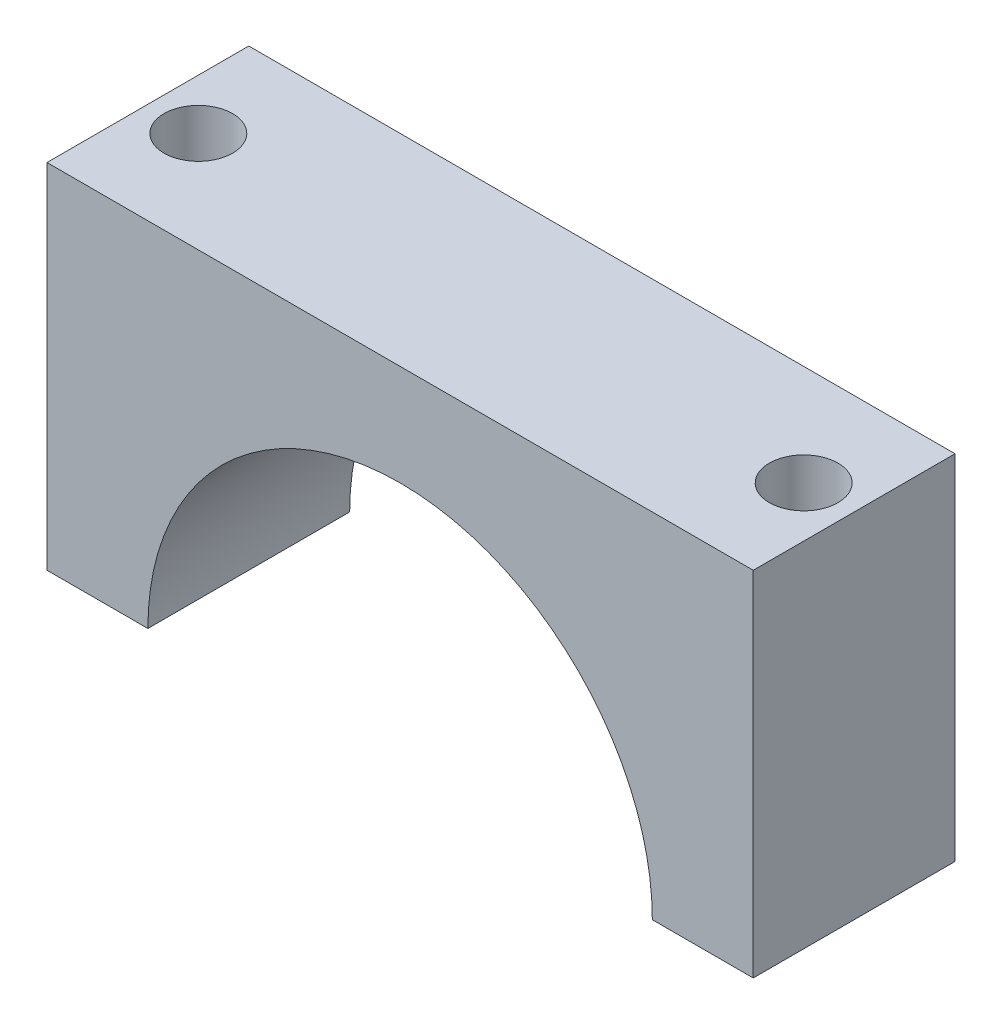
ISO-10303-21;
HEADER;
FILE_DESCRIPTION(('STEP AP214'),'2;1');
FILE_NAME('part.step','',(''),(''),'','','');
FILE_SCHEMA(('AUTOMOTIVE_DESIGN { 1 0 10303 214 1 1 1 1 }'));
ENDSEC;
DATA;
#1=APPLICATION_CONTEXT('core data for automotive mechanical design processes');
#2=APPLICATION_PROTOCOL_DEFINITION('international standard','automotive_design',2000,#1);
#3=PRODUCT_CONTEXT('',#1,'mechanical');
#4=PRODUCT('Part','Part','',(#3));
#5=PRODUCT_RELATED_PRODUCT_CATEGORY('part','',(#4));
#6=PRODUCT_DEFINITION_FORMATION('','',#4);
#7=PRODUCT_DEFINITION_CONTEXT('part definition',#1,'design');
#8=PRODUCT_DEFINITION('design','',#6,#7);
#9=PRODUCT_DEFINITION_SHAPE('','',#8);
#10=(LENGTH_UNIT() NAMED_UNIT(*) SI_UNIT(.MILLI.,.METRE.));
#11=(NAMED_UNIT(*) PLANE_ANGLE_UNIT() SI_UNIT($,.RADIAN.));
#12=(NAMED_UNIT(*) SI_UNIT($,.STERADIAN.) SOLID_ANGLE_UNIT());
#13=UNCERTAINTY_MEASURE_WITH_UNIT(LENGTH_MEASURE(1.E-05),#10,'distance_accuracy_value','');
#14=(GEOMETRIC_REPRESENTATION_CONTEXT(3) GLOBAL_UNCERTAINTY_ASSIGNED_CONTEXT((#13)) GLOBAL_UNIT_ASSIGNED_CONTEXT((#10,
#11,#12)) REPRESENTATION_CONTEXT('',''));
#15=CARTESIAN_POINT('',(0.,0.,0.));
#16=DIRECTION('',(0.,0.,1.));
#17=DIRECTION('',(1.,0.,0.));
#18=AXIS2_PLACEMENT_3D('',#15,#16,#17);
#19=CARTESIAN_POINT('',(17.5,0.,10.));
#20=DIRECTION('',(-1.,0.,0.));
#21=DIRECTION('',(0.,-1.,0.));
#22=AXIS2_PLACEMENT_3D('',#19,#20,#21);
#23=PLANE('',#22);
#24=DIRECTION('',(0.,1.,0.));
#25=VECTOR('',#24,1.);
#26=CARTESIAN_POINT('',(17.5,0.,0.));
#27=LINE('',#26,#25);
#28=CARTESIAN_POINT('',(17.5,0.,0.));
#29=VERTEX_POINT('',#28);
#30=CARTESIAN_POINT('',(17.5,17.5,0.));
#31=VERTEX_POINT('',#30);
#32=EDGE_CURVE('E116',#29,#31,#27,.T.);
#33=ORIENTED_EDGE('',*,*,#32,.T.);
#34=DIRECTION('',(0.,0.,-1.));
#35=VECTOR('',#34,1.);
#36=CARTESIAN_POINT('',(17.5,17.5,10.));
#37=LINE('',#36,#35);
#38=CARTESIAN_POINT('',(17.5,17.5,10.));
#39=VERTEX_POINT('',#38);
#40=EDGE_CURVE('E11',#39,#31,#37,.T.);
#41=ORIENTED_EDGE('',*,*,#40,.F.);
#42=DIRECTION('',(0.,1.,0.));
#43=VECTOR('',#42,1.);
#44=CARTESIAN_POINT('',(17.5,0.,10.));
#45=LINE('',#44,#43);
#46=CARTESIAN_POINT('',(17.5,0.,10.));
#47=VERTEX_POINT('',#46);
#48=EDGE_CURVE('E127',#47,#39,#45,.T.);
#49=ORIENTED_EDGE('',*,*,#48,.F.);
#50=DIRECTION('',(0.,0.,-1.));
#51=VECTOR('',#50,1.);
#52=CARTESIAN_POINT('',(17.5,0.,10.));
#53=LINE('',#52,#51);
#54=EDGE_CURVE('E112',#47,#29,#53,.T.);
#55=ORIENTED_EDGE('',*,*,#54,.T.);
#56=EDGE_LOOP('',(#33,#41,#49,#55));
#57=FACE_BOUND('',#56,.T.);
#58=ADVANCED_FACE('F32',(#57),#23,.F.);
#59=CARTESIAN_POINT('',(-17.5,17.5,10.));
#60=DIRECTION('',(0.,-1.,0.));
#61=DIRECTION('',(0.,0.,-1.));
#62=AXIS2_PLACEMENT_3D('',#59,#60,#61);
#63=PLANE('',#62);
#64=CARTESIAN_POINT('',(-15.,17.5,5.));
#65=DIRECTION('',(0.,1.,0.));
#66=DIRECTION('',(0.,0.,1.));
#67=AXIS2_PLACEMENT_3D('',#64,#65,#66);
#68=CIRCLE('',#67,1.7);
#69=CARTESIAN_POINT('',(-15.,17.5,6.7));
#70=VERTEX_POINT('',#69);
#71=EDGE_CURVE('E174',#70,#70,#68,.T.);
#72=ORIENTED_EDGE('',*,*,#71,.F.);
#73=EDGE_LOOP('',(#72));
#74=FACE_BOUND('',#73,.T.);
#75=CARTESIAN_POINT('',(15.,17.5,5.));
#76=DIRECTION('',(0.,1.,0.));
#77=DIRECTION('',(0.,0.,1.));
#78=AXIS2_PLACEMENT_3D('',#75,#76,#77);
#79=CIRCLE('',#78,1.7);
#80=CARTESIAN_POINT('',(15.,17.5,6.7));
#81=VERTEX_POINT('',#80);
#82=EDGE_CURVE('E173',#81,#81,#79,.T.);
#83=ORIENTED_EDGE('',*,*,#82,.F.);
#84=EDGE_LOOP('',(#83));
#85=FACE_BOUND('',#84,.T.);
#86=DIRECTION('',(-1.,0.,0.));
#87=VECTOR('',#86,1.);
#88=CARTESIAN_POINT('',(-17.5,17.5,0.));
#89=LINE('',#88,#87);
#90=CARTESIAN_POINT('',(-17.5,17.5,0.));
#91=VERTEX_POINT('',#90);
#92=EDGE_CURVE('E119',#31,#91,#89,.T.);
#93=ORIENTED_EDGE('',*,*,#92,.T.);
#94=DIRECTION('',(0.,0.,-1.));
#95=VECTOR('',#94,1.);
#96=CARTESIAN_POINT('',(-17.5,17.5,10.));
#97=LINE('',#96,#95);
#98=CARTESIAN_POINT('',(-17.5,17.5,10.));
#99=VERTEX_POINT('',#98);
#100=EDGE_CURVE('E40',#99,#91,#97,.T.);
#101=ORIENTED_EDGE('',*,*,#100,.F.);
#102=DIRECTION('',(-1.,0.,0.));
#103=VECTOR('',#102,1.);
#104=CARTESIAN_POINT('',(-17.5,17.5,10.));
#105=LINE('',#104,#103);
#106=EDGE_CURVE('E85',#39,#99,#105,.T.);
#107=ORIENTED_EDGE('',*,*,#106,.F.);
#108=ORIENTED_EDGE('',*,*,#40,.T.);
#109=EDGE_LOOP('',(#93,#101,#107,#108));
#110=FACE_BOUND('',#109,.T.);
#111=ADVANCED_FACE('F153',(#74,#85,#110),#63,.F.);
#112=CARTESIAN_POINT('',(-17.5,0.,10.));
#113=DIRECTION('',(1.,0.,0.));
#114=DIRECTION('',(0.,0.,-1.));
#115=AXIS2_PLACEMENT_3D('',#112,#113,#114);
#116=PLANE('',#115);
#117=DIRECTION('',(0.,-1.,0.));
#118=VECTOR('',#117,1.);
#119=CARTESIAN_POINT('',(-17.5,0.,0.));
#120=LINE('',#119,#118);
#121=CARTESIAN_POINT('',(-17.5,0.,0.));
#122=VERTEX_POINT('',#121);
#123=EDGE_CURVE('E122',#91,#122,#120,.T.);
#124=ORIENTED_EDGE('',*,*,#123,.T.);
#125=DIRECTION('',(0.,0.,-1.));
#126=VECTOR('',#125,1.);
#127=CARTESIAN_POINT('',(-17.5,0.,10.));
#128=LINE('',#127,#126);
#129=CARTESIAN_POINT('',(-17.5,0.,10.));
#130=VERTEX_POINT('',#129);
#131=EDGE_CURVE('E107',#130,#122,#128,.T.);
#132=ORIENTED_EDGE('',*,*,#131,.F.);
#133=DIRECTION('',(0.,-1.,0.));
#134=VECTOR('',#133,1.);
#135=CARTESIAN_POINT('',(-17.5,0.,10.));
#136=LINE('',#135,#134);
#137=EDGE_CURVE('E98',#99,#130,#136,.T.);
#138=ORIENTED_EDGE('',*,*,#137,.F.);
#139=ORIENTED_EDGE('',*,*,#100,.T.);
#140=EDGE_LOOP('',(#124,#132,#138,#139));
#141=FACE_BOUND('',#140,.T.);
#142=ADVANCED_FACE('F133',(#141),#116,.F.);
#143=CARTESIAN_POINT('',(-12.5,0.,10.));
#144=DIRECTION('',(0.,1.,0.));
#145=DIRECTION('',(0.,0.,1.));
#146=AXIS2_PLACEMENT_3D('',#143,#144,#145);
#147=PLANE('',#146);
#148=CARTESIAN_POINT('',(-15.,0.,5.));
#149=DIRECTION('',(0.,1.,0.));
#150=DIRECTION('',(0.,0.,1.));
#151=AXIS2_PLACEMENT_3D('',#148,#149,#150);
#152=CIRCLE('',#151,1.7);
#153=CARTESIAN_POINT('',(-15.,0.,6.7));
#154=VERTEX_POINT('',#153);
#155=EDGE_CURVE('E171',#154,#154,#152,.T.);
#156=ORIENTED_EDGE('',*,*,#155,.T.);
#157=EDGE_LOOP('',(#156));
#158=FACE_BOUND('',#157,.T.);
#159=DIRECTION('',(1.,0.,0.));
#160=VECTOR('',#159,1.);
#161=CARTESIAN_POINT('',(-12.5,0.,0.));
#162=LINE('',#161,#160);
#163=CARTESIAN_POINT('',(-12.5,0.,0.));
#164=VERTEX_POINT('',#163);
#165=EDGE_CURVE('E106',#122,#164,#162,.T.);
#166=ORIENTED_EDGE('',*,*,#165,.T.);
#167=DIRECTION('',(0.,0.,-1.));
#168=VECTOR('',#167,1.);
#169=CARTESIAN_POINT('',(-12.5,0.,10.));
#170=LINE('',#169,#168);
#171=CARTESIAN_POINT('',(-12.5,0.,10.));
#172=VERTEX_POINT('',#171);
#173=EDGE_CURVE('E103',#172,#164,#170,.T.);
#174=ORIENTED_EDGE('',*,*,#173,.F.);
#175=DIRECTION('',(1.,0.,0.));
#176=VECTOR('',#175,1.);
#177=CARTESIAN_POINT('',(-12.5,0.,10.));
#178=LINE('',#177,#176);
#179=EDGE_CURVE('E92',#130,#172,#178,.T.);
#180=ORIENTED_EDGE('',*,*,#179,.F.);
#181=ORIENTED_EDGE('',*,*,#131,.T.);
#182=EDGE_LOOP('',(#166,#174,#180,#181));
#183=FACE_BOUND('',#182,.T.);
#184=ADVANCED_FACE('F104',(#158,#183),#147,.F.);
#185=CARTESIAN_POINT('',(0.,0.,10.));
#186=DIRECTION('',(0.,0.,-1.));
#187=DIRECTION('',(-1.,0.,0.));
#188=AXIS2_PLACEMENT_3D('',#185,#186,#187);
#189=CYLINDRICAL_SURFACE('',#188,12.5);
#190=CARTESIAN_POINT('',(0.,0.,0.));
#191=DIRECTION('',(0.,0.,-1.));
#192=DIRECTION('',(1.,0.,0.));
#193=AXIS2_PLACEMENT_3D('',#190,#191,#192);
#194=CIRCLE('',#193,12.5);
#195=CARTESIAN_POINT('',(12.5,0.,0.));
#196=VERTEX_POINT('',#195);
#197=EDGE_CURVE('E71',#164,#196,#194,.T.);
#198=ORIENTED_EDGE('',*,*,#197,.T.);
#199=DIRECTION('',(0.,0.,-1.));
#200=VECTOR('',#199,1.);
#201=CARTESIAN_POINT('',(12.5,0.,10.));
#202=LINE('',#201,#200);
#203=CARTESIAN_POINT('',(12.5,0.,10.));
#204=VERTEX_POINT('',#203);
#205=EDGE_CURVE('E108',#204,#196,#202,.T.);
#206=ORIENTED_EDGE('',*,*,#205,.F.);
#207=CARTESIAN_POINT('',(0.,0.,10.));
#208=DIRECTION('',(0.,0.,-1.));
#209=DIRECTION('',(1.,0.,0.));
#210=AXIS2_PLACEMENT_3D('',#207,#208,#209);
#211=CIRCLE('',#210,12.5);
#212=EDGE_CURVE('E96',#172,#204,#211,.T.);
#213=ORIENTED_EDGE('',*,*,#212,.F.);
#214=ORIENTED_EDGE('',*,*,#173,.T.);
#215=EDGE_LOOP('',(#198,#206,#213,#214));
#216=FACE_BOUND('',#215,.T.);
#217=ADVANCED_FACE('F110',(#216),#189,.F.);
#218=CARTESIAN_POINT('',(12.5,0.,10.));
#219=DIRECTION('',(0.,1.,0.));
#220=DIRECTION('',(0.,0.,1.));
#221=AXIS2_PLACEMENT_3D('',#218,#219,#220);
#222=PLANE('',#221);
#223=CARTESIAN_POINT('',(15.,0.,5.));
#224=DIRECTION('',(0.,1.,0.));
#225=DIRECTION('',(0.,0.,1.));
#226=AXIS2_PLACEMENT_3D('',#223,#224,#225);
#227=CIRCLE('',#226,1.69999999999999);
#228=CARTESIAN_POINT('',(15.,0.,6.69999999999999));
#229=VERTEX_POINT('',#228);
#230=EDGE_CURVE('E120',#229,#229,#227,.T.);
#231=ORIENTED_EDGE('',*,*,#230,.T.);
#232=EDGE_LOOP('',(#231));
#233=FACE_BOUND('',#232,.T.);
#234=DIRECTION('',(1.,0.,0.));
#235=VECTOR('',#234,1.);
#236=CARTESIAN_POINT('',(12.5,0.,0.));
#237=LINE('',#236,#235);
#238=EDGE_CURVE('E77',#196,#29,#237,.T.);
#239=ORIENTED_EDGE('',*,*,#238,.T.);
#240=ORIENTED_EDGE('',*,*,#54,.F.);
#241=DIRECTION('',(1.,0.,0.));
#242=VECTOR('',#241,1.);
#243=CARTESIAN_POINT('',(12.5,0.,10.));
#244=LINE('',#243,#242);
#245=EDGE_CURVE('E48',#204,#47,#244,.T.);
#246=ORIENTED_EDGE('',*,*,#245,.F.);
#247=ORIENTED_EDGE('',*,*,#205,.T.);
#248=EDGE_LOOP('',(#239,#240,#246,#247));
#249=FACE_BOUND('',#248,.T.);
#250=ADVANCED_FACE('F140',(#233,#249),#222,.F.);
#251=CARTESIAN_POINT('',(0.,0.,10.));
#252=DIRECTION('',(0.,0.,1.));
#253=DIRECTION('',(1.,0.,0.));
#254=AXIS2_PLACEMENT_3D('',#251,#252,#253);
#255=PLANE('',#254);
#256=ORIENTED_EDGE('',*,*,#48,.T.);
#257=ORIENTED_EDGE('',*,*,#106,.T.);
#258=ORIENTED_EDGE('',*,*,#137,.T.);
#259=ORIENTED_EDGE('',*,*,#179,.T.);
#260=ORIENTED_EDGE('',*,*,#212,.T.);
#261=ORIENTED_EDGE('',*,*,#245,.T.);
#262=EDGE_LOOP('',(#256,#257,#258,#259,#260,#261));
#263=FACE_BOUND('',#262,.T.);
#264=ADVANCED_FACE('F94',(#263),#255,.T.);
#265=CARTESIAN_POINT('',(0.,0.,0.));
#266=DIRECTION('',(0.,0.,1.));
#267=DIRECTION('',(1.,0.,0.));
#268=AXIS2_PLACEMENT_3D('',#265,#266,#267);
#269=PLANE('',#268);
#270=ORIENTED_EDGE('',*,*,#32,.F.);
#271=ORIENTED_EDGE('',*,*,#238,.F.);
#272=ORIENTED_EDGE('',*,*,#197,.F.);
#273=ORIENTED_EDGE('',*,*,#165,.F.);
#274=ORIENTED_EDGE('',*,*,#123,.F.);
#275=ORIENTED_EDGE('',*,*,#92,.F.);
#276=EDGE_LOOP('',(#270,#271,#272,#273,#274,#275));
#277=FACE_BOUND('',#276,.T.);
#278=ADVANCED_FACE('F136',(#277),#269,.F.);
#279=CARTESIAN_POINT('',(15.,17.5,5.));
#280=DIRECTION('',(0.,1.,0.));
#281=DIRECTION('',(0.,0.,1.));
#282=AXIS2_PLACEMENT_3D('',#279,#280,#281);
#283=CYLINDRICAL_SURFACE('',#282,1.7);
#284=ORIENTED_EDGE('',*,*,#230,.F.);
#285=EDGE_LOOP('',(#284));
#286=FACE_BOUND('',#285,.T.);
#287=ORIENTED_EDGE('',*,*,#82,.T.);
#288=EDGE_LOOP('',(#287));
#289=FACE_BOUND('',#288,.T.);
#290=ADVANCED_FACE('F185',(#286,#289),#283,.F.);
#291=CARTESIAN_POINT('',(-15.,17.5,5.));
#292=DIRECTION('',(0.,1.,0.));
#293=DIRECTION('',(0.,0.,1.));
#294=AXIS2_PLACEMENT_3D('',#291,#292,#293);
#295=CYLINDRICAL_SURFACE('',#294,1.7);
#296=ORIENTED_EDGE('',*,*,#155,.F.);
#297=EDGE_LOOP('',(#296));
#298=FACE_BOUND('',#297,.T.);
#299=ORIENTED_EDGE('',*,*,#71,.T.);
#300=EDGE_LOOP('',(#299));
#301=FACE_BOUND('',#300,.T.);
#302=ADVANCED_FACE('F188',(#298,#301),#295,.F.);
#303=CLOSED_SHELL('',(#58,#111,#142,#184,#217,#250,#264,#278,#290,#302));
#304=MANIFOLD_SOLID_BREP('B2',#303);
#305=ADVANCED_BREP_SHAPE_REPRESENTATION('',(#18,#304),#14);
#306=SHAPE_DEFINITION_REPRESENTATION(#9,#305);
ENDSEC;
END-ISO-10303-21;
